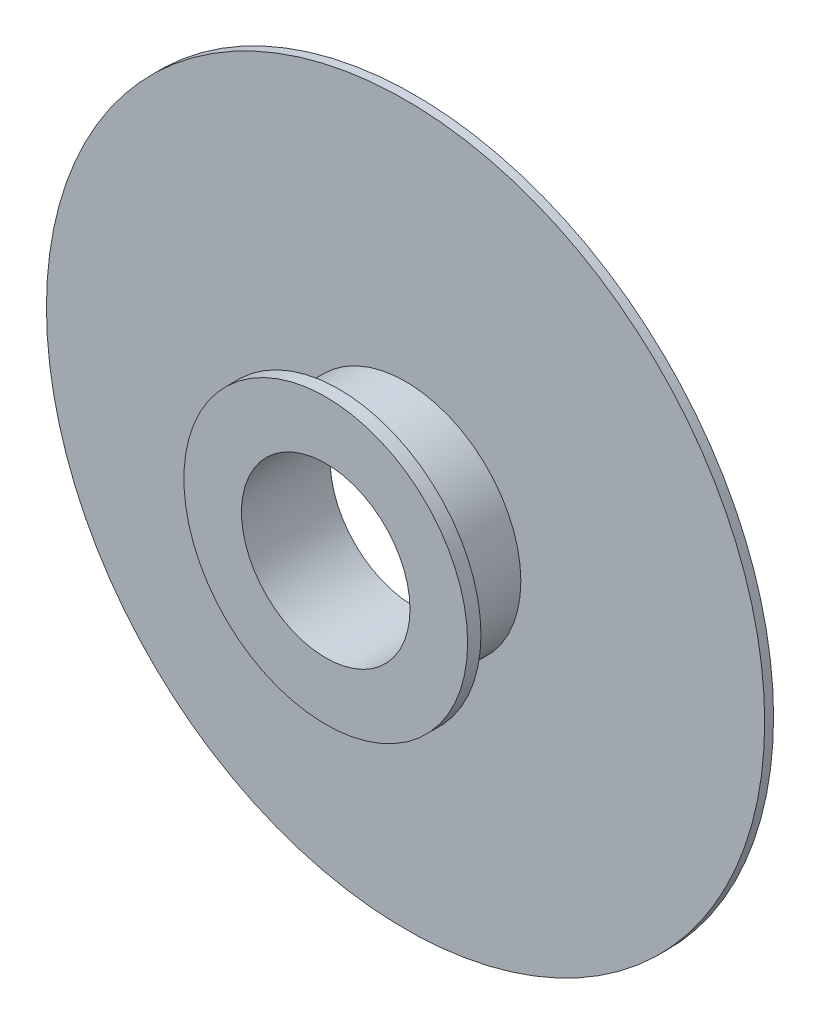
ISO-10303-21;
HEADER;
FILE_DESCRIPTION(('STEP AP214'),'2;1');
FILE_NAME('part.step','',(''),(''),'','','');
FILE_SCHEMA(('AUTOMOTIVE_DESIGN { 1 0 10303 214 1 1 1 1 }'));
ENDSEC;
DATA;
#1=APPLICATION_CONTEXT('core data for automotive mechanical design processes');
#2=APPLICATION_PROTOCOL_DEFINITION('international standard','automotive_design',2000,#1);
#3=PRODUCT_CONTEXT('',#1,'mechanical');
#4=PRODUCT('Part','Part','',(#3));
#5=PRODUCT_RELATED_PRODUCT_CATEGORY('part','',(#4));
#6=PRODUCT_DEFINITION_FORMATION('','',#4);
#7=PRODUCT_DEFINITION_CONTEXT('part definition',#1,'design');
#8=PRODUCT_DEFINITION('design','',#6,#7);
#9=PRODUCT_DEFINITION_SHAPE('','',#8);
#10=(LENGTH_UNIT() NAMED_UNIT(*) SI_UNIT(.MILLI.,.METRE.));
#11=(NAMED_UNIT(*) PLANE_ANGLE_UNIT() SI_UNIT($,.RADIAN.));
#12=(NAMED_UNIT(*) SI_UNIT($,.STERADIAN.) SOLID_ANGLE_UNIT());
#13=UNCERTAINTY_MEASURE_WITH_UNIT(LENGTH_MEASURE(1.E-05),#10,'distance_accuracy_value','');
#14=(GEOMETRIC_REPRESENTATION_CONTEXT(3) GLOBAL_UNCERTAINTY_ASSIGNED_CONTEXT((#13)) GLOBAL_UNIT_ASSIGNED_CONTEXT((#10,
#11,#12)) REPRESENTATION_CONTEXT('',''));
#15=CARTESIAN_POINT('',(0.,0.,0.));
#16=DIRECTION('',(0.,0.,1.));
#17=DIRECTION('',(1.,0.,0.));
#18=AXIS2_PLACEMENT_3D('',#15,#16,#17);
#19=CARTESIAN_POINT('',(0.,0.,20.));
#20=DIRECTION('',(0.,0.,-1.));
#21=DIRECTION('',(-1.,0.,0.));
#22=AXIS2_PLACEMENT_3D('',#19,#20,#21);
#23=CYLINDRICAL_SURFACE('',#22,26.);
#24=CARTESIAN_POINT('',(0.,0.,2.));
#25=DIRECTION('',(0.,0.,1.));
#26=DIRECTION('',(1.,0.,0.));
#27=AXIS2_PLACEMENT_3D('',#24,#25,#26);
#28=CIRCLE('',#27,26.);
#29=CARTESIAN_POINT('',(26.,0.,2.));
#30=VERTEX_POINT('',#29);
#31=EDGE_CURVE('E51',#30,#30,#28,.T.);
#32=ORIENTED_EDGE('',*,*,#31,.T.);
#33=EDGE_LOOP('',(#32));
#34=FACE_BOUND('',#33,.T.);
#35=CARTESIAN_POINT('',(0.,0.,17.));
#36=DIRECTION('',(0.,0.,1.));
#37=DIRECTION('',(1.,0.,0.));
#38=AXIS2_PLACEMENT_3D('',#35,#36,#37);
#39=CIRCLE('',#38,26.);
#40=CARTESIAN_POINT('',(26.,0.,17.));
#41=VERTEX_POINT('',#40);
#42=EDGE_CURVE('E10',#41,#41,#39,.T.);
#43=ORIENTED_EDGE('',*,*,#42,.F.);
#44=EDGE_LOOP('',(#43));
#45=FACE_BOUND('',#44,.T.);
#46=ADVANCED_FACE('F31',(#34,#45),#23,.T.);
#47=CARTESIAN_POINT('',(0.,0.,2.));
#48=DIRECTION('',(0.,0.,1.));
#49=DIRECTION('',(1.,0.,0.));
#50=AXIS2_PLACEMENT_3D('',#47,#48,#49);
#51=PLANE('',#50);
#52=CARTESIAN_POINT('',(0.,0.,2.));
#53=DIRECTION('',(0.,0.,1.));
#54=DIRECTION('',(1.,0.,0.));
#55=AXIS2_PLACEMENT_3D('',#52,#53,#54);
#56=CIRCLE('',#55,81.);
#57=CARTESIAN_POINT('',(81.,0.,2.));
#58=VERTEX_POINT('',#57);
#59=EDGE_CURVE('E38',#58,#58,#56,.T.);
#60=ORIENTED_EDGE('',*,*,#59,.T.);
#61=EDGE_LOOP('',(#60));
#62=FACE_BOUND('',#61,.T.);
#63=ORIENTED_EDGE('',*,*,#31,.F.);
#64=EDGE_LOOP('',(#63));
#65=FACE_BOUND('',#64,.T.);
#66=ADVANCED_FACE('F76',(#62,#65),#51,.T.);
#67=CARTESIAN_POINT('',(0.,0.,0.));
#68=DIRECTION('',(0.,0.,1.));
#69=DIRECTION('',(1.,0.,0.));
#70=AXIS2_PLACEMENT_3D('',#67,#68,#69);
#71=PLANE('',#70);
#72=CARTESIAN_POINT('',(0.,0.,0.));
#73=DIRECTION('',(0.,0.,1.));
#74=DIRECTION('',(1.,0.,0.));
#75=AXIS2_PLACEMENT_3D('',#72,#73,#74);
#76=CIRCLE('',#75,81.);
#77=CARTESIAN_POINT('',(81.,0.,0.));
#78=VERTEX_POINT('',#77);
#79=EDGE_CURVE('E42',#78,#78,#76,.T.);
#80=ORIENTED_EDGE('',*,*,#79,.F.);
#81=EDGE_LOOP('',(#80));
#82=FACE_BOUND('',#81,.T.);
#83=CARTESIAN_POINT('',(0.,0.,0.));
#84=DIRECTION('',(0.,0.,1.));
#85=DIRECTION('',(1.,0.,0.));
#86=AXIS2_PLACEMENT_3D('',#83,#84,#85);
#87=CIRCLE('',#86,19.);
#88=CARTESIAN_POINT('',(19.,0.,0.));
#89=VERTEX_POINT('',#88);
#90=EDGE_CURVE('E47',#89,#89,#87,.T.);
#91=ORIENTED_EDGE('',*,*,#90,.T.);
#92=EDGE_LOOP('',(#91));
#93=FACE_BOUND('',#92,.T.);
#94=ADVANCED_FACE('F82',(#82,#93),#71,.F.);
#95=CARTESIAN_POINT('',(0.,0.,2.));
#96=DIRECTION('',(0.,0.,-1.));
#97=DIRECTION('',(-1.,0.,0.));
#98=AXIS2_PLACEMENT_3D('',#95,#96,#97);
#99=CYLINDRICAL_SURFACE('',#98,81.);
#100=ORIENTED_EDGE('',*,*,#59,.F.);
#101=EDGE_LOOP('',(#100));
#102=FACE_BOUND('',#101,.T.);
#103=ORIENTED_EDGE('',*,*,#79,.T.);
#104=EDGE_LOOP('',(#103));
#105=FACE_BOUND('',#104,.T.);
#106=ADVANCED_FACE('F33',(#102,#105),#99,.T.);
#107=CARTESIAN_POINT('',(0.,0.,2.));
#108=DIRECTION('',(0.,0.,-1.));
#109=DIRECTION('',(-1.,0.,0.));
#110=AXIS2_PLACEMENT_3D('',#107,#108,#109);
#111=CYLINDRICAL_SURFACE('',#110,19.);
#112=ORIENTED_EDGE('',*,*,#90,.F.);
#113=EDGE_LOOP('',(#112));
#114=FACE_BOUND('',#113,.T.);
#115=CARTESIAN_POINT('',(0.,0.,20.));
#116=DIRECTION('',(0.,0.,1.));
#117=DIRECTION('',(1.,0.,0.));
#118=AXIS2_PLACEMENT_3D('',#115,#116,#117);
#119=CIRCLE('',#118,19.);
#120=CARTESIAN_POINT('',(19.,0.,20.));
#121=VERTEX_POINT('',#120);
#122=EDGE_CURVE('E54',#121,#121,#119,.T.);
#123=ORIENTED_EDGE('',*,*,#122,.T.);
#124=EDGE_LOOP('',(#123));
#125=FACE_BOUND('',#124,.T.);
#126=ADVANCED_FACE('F87',(#114,#125),#111,.F.);
#127=CARTESIAN_POINT('',(0.,0.,20.));
#128=DIRECTION('',(0.,0.,1.));
#129=DIRECTION('',(1.,0.,0.));
#130=AXIS2_PLACEMENT_3D('',#127,#128,#129);
#131=PLANE('',#130);
#132=ORIENTED_EDGE('',*,*,#122,.F.);
#133=EDGE_LOOP('',(#132));
#134=FACE_BOUND('',#133,.T.);
#135=CARTESIAN_POINT('',(0.,0.,20.));
#136=DIRECTION('',(0.,0.,1.));
#137=DIRECTION('',(1.,0.,0.));
#138=AXIS2_PLACEMENT_3D('',#135,#136,#137);
#139=CIRCLE('',#138,32.);
#140=CARTESIAN_POINT('',(32.,0.,20.));
#141=VERTEX_POINT('',#140);
#142=EDGE_CURVE('E58',#141,#141,#139,.T.);
#143=ORIENTED_EDGE('',*,*,#142,.T.);
#144=EDGE_LOOP('',(#143));
#145=FACE_BOUND('',#144,.T.);
#146=ADVANCED_FACE('F73',(#134,#145),#131,.T.);
#147=CARTESIAN_POINT('',(0.,0.,17.));
#148=DIRECTION('',(0.,0.,1.));
#149=DIRECTION('',(1.,0.,0.));
#150=AXIS2_PLACEMENT_3D('',#147,#148,#149);
#151=CYLINDRICAL_SURFACE('',#150,32.);
#152=CARTESIAN_POINT('',(0.,0.,17.));
#153=DIRECTION('',(0.,0.,1.));
#154=DIRECTION('',(1.,0.,0.));
#155=AXIS2_PLACEMENT_3D('',#152,#153,#154);
#156=CIRCLE('',#155,32.);
#157=CARTESIAN_POINT('',(32.,0.,17.));
#158=VERTEX_POINT('',#157);
#159=EDGE_CURVE('E57',#158,#158,#156,.T.);
#160=ORIENTED_EDGE('',*,*,#159,.T.);
#161=EDGE_LOOP('',(#160));
#162=FACE_BOUND('',#161,.T.);
#163=ORIENTED_EDGE('',*,*,#142,.F.);
#164=EDGE_LOOP('',(#163));
#165=FACE_BOUND('',#164,.T.);
#166=ADVANCED_FACE('F64',(#162,#165),#151,.T.);
#167=CARTESIAN_POINT('',(0.,0.,17.));
#168=DIRECTION('',(0.,0.,1.));
#169=DIRECTION('',(1.,0.,0.));
#170=AXIS2_PLACEMENT_3D('',#167,#168,#169);
#171=PLANE('',#170);
#172=ORIENTED_EDGE('',*,*,#42,.T.);
#173=EDGE_LOOP('',(#172));
#174=FACE_BOUND('',#173,.T.);
#175=ORIENTED_EDGE('',*,*,#159,.F.);
#176=EDGE_LOOP('',(#175));
#177=FACE_BOUND('',#176,.T.);
#178=ADVANCED_FACE('F67',(#174,#177),#171,.F.);
#179=CLOSED_SHELL('',(#46,#66,#94,#106,#126,#146,#166,#178));
#180=MANIFOLD_SOLID_BREP('B2',#179);
#181=ADVANCED_BREP_SHAPE_REPRESENTATION('',(#18,#180),#14);
#182=SHAPE_DEFINITION_REPRESENTATION(#9,#181);
ENDSEC;
END-ISO-10303-21;
